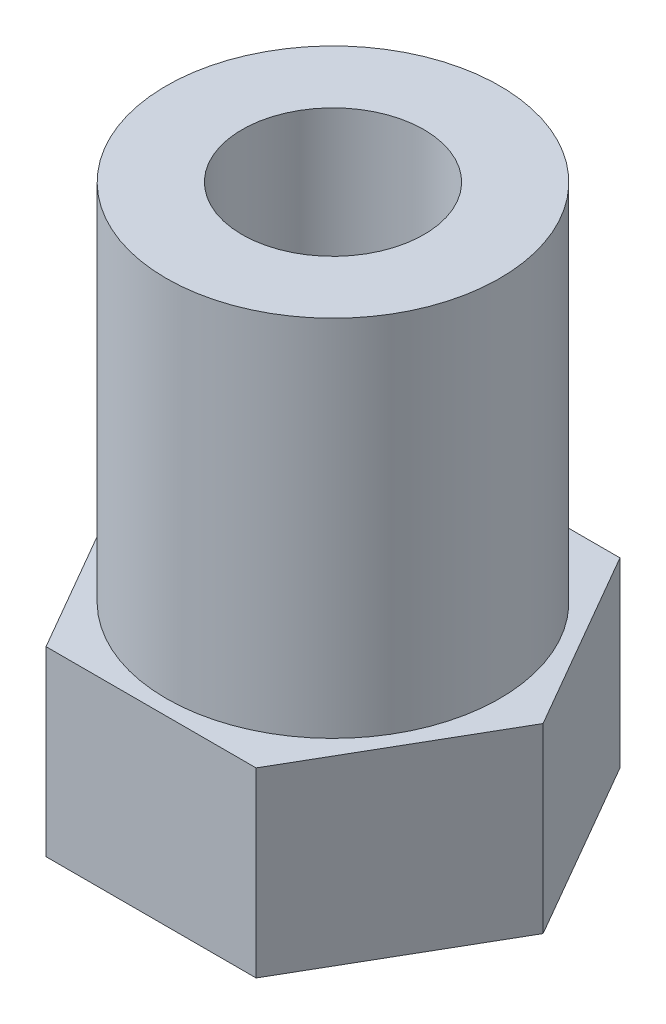
ISO-10303-21;
HEADER;
FILE_DESCRIPTION(('STEP AP214'),'2;1');
FILE_NAME('part.step','',(''),(''),'','','');
FILE_SCHEMA(('AUTOMOTIVE_DESIGN { 1 0 10303 214 1 1 1 1 }'));
ENDSEC;
DATA;
#1=APPLICATION_CONTEXT('core data for automotive mechanical design processes');
#2=APPLICATION_PROTOCOL_DEFINITION('international standard','automotive_design',2000,#1);
#3=PRODUCT_CONTEXT('',#1,'mechanical');
#4=PRODUCT('Part','Part','',(#3));
#5=PRODUCT_RELATED_PRODUCT_CATEGORY('part','',(#4));
#6=PRODUCT_DEFINITION_FORMATION('','',#4);
#7=PRODUCT_DEFINITION_CONTEXT('part definition',#1,'design');
#8=PRODUCT_DEFINITION('design','',#6,#7);
#9=PRODUCT_DEFINITION_SHAPE('','',#8);
#10=(LENGTH_UNIT() NAMED_UNIT(*) SI_UNIT(.MILLI.,.METRE.));
#11=(NAMED_UNIT(*) PLANE_ANGLE_UNIT() SI_UNIT($,.RADIAN.));
#12=(NAMED_UNIT(*) SI_UNIT($,.STERADIAN.) SOLID_ANGLE_UNIT());
#13=UNCERTAINTY_MEASURE_WITH_UNIT(LENGTH_MEASURE(1.E-05),#10,'distance_accuracy_value','');
#14=(GEOMETRIC_REPRESENTATION_CONTEXT(3) GLOBAL_UNCERTAINTY_ASSIGNED_CONTEXT((#13)) GLOBAL_UNIT_ASSIGNED_CONTEXT((#10,
#11,#12)) REPRESENTATION_CONTEXT('',''));
#15=CARTESIAN_POINT('',(0.,0.,0.));
#16=DIRECTION('',(0.,0.,1.));
#17=DIRECTION('',(1.,0.,0.));
#18=AXIS2_PLACEMENT_3D('',#15,#16,#17);
#19=CARTESIAN_POINT('',(0.,6.,0.));
#20=DIRECTION('',(0.,1.,0.));
#21=DIRECTION('',(0.,0.,1.));
#22=AXIS2_PLACEMENT_3D('',#19,#20,#21);
#23=PLANE('',#22);
#24=CARTESIAN_POINT('',(0.,6.,0.));
#25=DIRECTION('',(0.,1.,0.));
#26=DIRECTION('',(0.,0.,1.));
#27=AXIS2_PLACEMENT_3D('',#24,#25,#26);
#28=CIRCLE('',#27,5.5);
#29=CARTESIAN_POINT('',(0.,6.,5.5));
#30=VERTEX_POINT('',#29);
#31=EDGE_CURVE('E11',#30,#30,#28,.T.);
#32=ORIENTED_EDGE('',*,*,#31,.F.);
#33=EDGE_LOOP('',(#32));
#34=FACE_BOUND('',#33,.T.);
#35=DIRECTION('',(0.499999999999999,0.,-0.866025403784439));
#36=VECTOR('',#35,1.);
#37=CARTESIAN_POINT('',(3.46410161513776,6.,6.));
#38=LINE('',#37,#36);
#39=CARTESIAN_POINT('',(3.46410161513776,6.,6.));
#40=VERTEX_POINT('',#39);
#41=CARTESIAN_POINT('',(6.92820323027551,6.,0.));
#42=VERTEX_POINT('',#41);
#43=EDGE_CURVE('E147',#40,#42,#38,.T.);
#44=ORIENTED_EDGE('',*,*,#43,.T.);
#45=DIRECTION('',(-0.5,0.,-0.866025403784439));
#46=VECTOR('',#45,1.);
#47=CARTESIAN_POINT('',(6.92820323027551,6.,0.));
#48=LINE('',#47,#46);
#49=CARTESIAN_POINT('',(3.46410161513775,6.,-6.));
#50=VERTEX_POINT('',#49);
#51=EDGE_CURVE('E96',#42,#50,#48,.T.);
#52=ORIENTED_EDGE('',*,*,#51,.T.);
#53=DIRECTION('',(-1.,0.,0.));
#54=VECTOR('',#53,1.);
#55=CARTESIAN_POINT('',(3.46410161513775,6.,-6.));
#56=LINE('',#55,#54);
#57=CARTESIAN_POINT('',(-3.46410161513776,6.,-6.));
#58=VERTEX_POINT('',#57);
#59=EDGE_CURVE('E108',#50,#58,#56,.T.);
#60=ORIENTED_EDGE('',*,*,#59,.T.);
#61=DIRECTION('',(-0.499999999999999,0.,0.866025403784439));
#62=VECTOR('',#61,1.);
#63=CARTESIAN_POINT('',(-3.46410161513776,6.,-6.));
#64=LINE('',#63,#62);
#65=CARTESIAN_POINT('',(-6.92820323027551,6.,0.));
#66=VERTEX_POINT('',#65);
#67=EDGE_CURVE('E103',#58,#66,#64,.T.);
#68=ORIENTED_EDGE('',*,*,#67,.T.);
#69=DIRECTION('',(0.5,0.,0.866025403784439));
#70=VECTOR('',#69,1.);
#71=CARTESIAN_POINT('',(-6.92820323027551,6.,0.));
#72=LINE('',#71,#70);
#73=CARTESIAN_POINT('',(-3.46410161513775,6.,6.));
#74=VERTEX_POINT('',#73);
#75=EDGE_CURVE('E106',#66,#74,#72,.T.);
#76=ORIENTED_EDGE('',*,*,#75,.T.);
#77=DIRECTION('',(1.,0.,0.));
#78=VECTOR('',#77,1.);
#79=CARTESIAN_POINT('',(-3.46410161513775,6.,6.));
#80=LINE('',#79,#78);
#81=EDGE_CURVE('E58',#74,#40,#80,.T.);
#82=ORIENTED_EDGE('',*,*,#81,.T.);
#83=EDGE_LOOP('',(#44,#52,#60,#68,#76,#82));
#84=FACE_BOUND('',#83,.T.);
#85=ADVANCED_FACE('F39',(#34,#84),#23,.T.);
#86=CARTESIAN_POINT('',(0.,0.,0.));
#87=DIRECTION('',(0.,1.,0.));
#88=DIRECTION('',(0.,0.,1.));
#89=AXIS2_PLACEMENT_3D('',#86,#87,#88);
#90=PLANE('',#89);
#91=DIRECTION('',(0.499999999999999,0.,-0.866025403784439));
#92=VECTOR('',#91,1.);
#93=CARTESIAN_POINT('',(3.46410161513776,0.,6.));
#94=LINE('',#93,#92);
#95=CARTESIAN_POINT('',(3.46410161513776,0.,6.));
#96=VERTEX_POINT('',#95);
#97=CARTESIAN_POINT('',(6.92820323027551,0.,0.));
#98=VERTEX_POINT('',#97);
#99=EDGE_CURVE('E130',#96,#98,#94,.T.);
#100=ORIENTED_EDGE('',*,*,#99,.F.);
#101=DIRECTION('',(1.,0.,0.));
#102=VECTOR('',#101,1.);
#103=CARTESIAN_POINT('',(-3.46410161513775,0.,6.));
#104=LINE('',#103,#102);
#105=CARTESIAN_POINT('',(-3.46410161513775,0.,6.));
#106=VERTEX_POINT('',#105);
#107=EDGE_CURVE('E87',#106,#96,#104,.T.);
#108=ORIENTED_EDGE('',*,*,#107,.F.);
#109=DIRECTION('',(0.5,0.,0.866025403784439));
#110=VECTOR('',#109,1.);
#111=CARTESIAN_POINT('',(-6.92820323027551,0.,0.));
#112=LINE('',#111,#110);
#113=CARTESIAN_POINT('',(-6.92820323027551,0.,0.));
#114=VERTEX_POINT('',#113);
#115=EDGE_CURVE('E81',#114,#106,#112,.T.);
#116=ORIENTED_EDGE('',*,*,#115,.F.);
#117=DIRECTION('',(-0.499999999999999,0.,0.866025403784439));
#118=VECTOR('',#117,1.);
#119=CARTESIAN_POINT('',(-3.46410161513776,0.,-6.));
#120=LINE('',#119,#118);
#121=CARTESIAN_POINT('',(-3.46410161513776,0.,-6.));
#122=VERTEX_POINT('',#121);
#123=EDGE_CURVE('E117',#122,#114,#120,.T.);
#124=ORIENTED_EDGE('',*,*,#123,.F.);
#125=DIRECTION('',(-1.,0.,0.));
#126=VECTOR('',#125,1.);
#127=CARTESIAN_POINT('',(3.46410161513775,0.,-6.));
#128=LINE('',#127,#126);
#129=CARTESIAN_POINT('',(3.46410161513775,0.,-6.));
#130=VERTEX_POINT('',#129);
#131=EDGE_CURVE('E138',#130,#122,#128,.T.);
#132=ORIENTED_EDGE('',*,*,#131,.F.);
#133=DIRECTION('',(-0.5,0.,-0.866025403784439));
#134=VECTOR('',#133,1.);
#135=CARTESIAN_POINT('',(6.92820323027551,0.,0.));
#136=LINE('',#135,#134);
#137=EDGE_CURVE('E134',#98,#130,#136,.T.);
#138=ORIENTED_EDGE('',*,*,#137,.F.);
#139=EDGE_LOOP('',(#100,#108,#116,#124,#132,#138));
#140=FACE_BOUND('',#139,.T.);
#141=CARTESIAN_POINT('',(0.,0.,0.));
#142=DIRECTION('',(0.,1.,0.));
#143=DIRECTION('',(0.,0.,1.));
#144=AXIS2_PLACEMENT_3D('',#141,#142,#143);
#145=CIRCLE('',#144,3.);
#146=CARTESIAN_POINT('',(0.,0.,3.));
#147=VERTEX_POINT('',#146);
#148=EDGE_CURVE('E135',#147,#147,#145,.T.);
#149=ORIENTED_EDGE('',*,*,#148,.T.);
#150=EDGE_LOOP('',(#149));
#151=FACE_BOUND('',#150,.T.);
#152=ADVANCED_FACE('F165',(#140,#151),#90,.F.);
#153=CARTESIAN_POINT('',(3.46410161513776,6.,6.));
#154=DIRECTION('',(-0.866025403784439,0.,-0.5));
#155=DIRECTION('',(-0.5,0.,0.866025403784439));
#156=AXIS2_PLACEMENT_3D('',#153,#154,#155);
#157=PLANE('',#156);
#158=ORIENTED_EDGE('',*,*,#99,.T.);
#159=DIRECTION('',(0.,-1.,0.));
#160=VECTOR('',#159,1.);
#161=CARTESIAN_POINT('',(6.92820323027551,6.,0.));
#162=LINE('',#161,#160);
#163=EDGE_CURVE('E43',#42,#98,#162,.T.);
#164=ORIENTED_EDGE('',*,*,#163,.F.);
#165=ORIENTED_EDGE('',*,*,#43,.F.);
#166=DIRECTION('',(0.,-1.,0.));
#167=VECTOR('',#166,1.);
#168=CARTESIAN_POINT('',(3.46410161513776,6.,6.));
#169=LINE('',#168,#167);
#170=EDGE_CURVE('E126',#40,#96,#169,.T.);
#171=ORIENTED_EDGE('',*,*,#170,.T.);
#172=EDGE_LOOP('',(#158,#164,#165,#171));
#173=FACE_BOUND('',#172,.T.);
#174=ADVANCED_FACE('F41',(#173),#157,.F.);
#175=CARTESIAN_POINT('',(6.92820323027551,6.,0.));
#176=DIRECTION('',(-0.866025403784438,0.,0.5));
#177=DIRECTION('',(0.5,0.,0.866025403784439));
#178=AXIS2_PLACEMENT_3D('',#175,#176,#177);
#179=PLANE('',#178);
#180=ORIENTED_EDGE('',*,*,#137,.T.);
#181=DIRECTION('',(0.,-1.,0.));
#182=VECTOR('',#181,1.);
#183=CARTESIAN_POINT('',(3.46410161513775,6.,-6.));
#184=LINE('',#183,#182);
#185=EDGE_CURVE('E153',#50,#130,#184,.T.);
#186=ORIENTED_EDGE('',*,*,#185,.F.);
#187=ORIENTED_EDGE('',*,*,#51,.F.);
#188=ORIENTED_EDGE('',*,*,#163,.T.);
#189=EDGE_LOOP('',(#180,#186,#187,#188));
#190=FACE_BOUND('',#189,.T.);
#191=ADVANCED_FACE('F160',(#190),#179,.F.);
#192=CARTESIAN_POINT('',(3.46410161513775,6.,-6.));
#193=DIRECTION('',(0.,0.,1.));
#194=DIRECTION('',(1.,0.,0.));
#195=AXIS2_PLACEMENT_3D('',#192,#193,#194);
#196=PLANE('',#195);
#197=ORIENTED_EDGE('',*,*,#131,.T.);
#198=DIRECTION('',(0.,-1.,0.));
#199=VECTOR('',#198,1.);
#200=CARTESIAN_POINT('',(-3.46410161513776,6.,-6.));
#201=LINE('',#200,#199);
#202=EDGE_CURVE('E119',#58,#122,#201,.T.);
#203=ORIENTED_EDGE('',*,*,#202,.F.);
#204=ORIENTED_EDGE('',*,*,#59,.F.);
#205=ORIENTED_EDGE('',*,*,#185,.T.);
#206=EDGE_LOOP('',(#197,#203,#204,#205));
#207=FACE_BOUND('',#206,.T.);
#208=ADVANCED_FACE('F167',(#207),#196,.F.);
#209=CARTESIAN_POINT('',(-3.46410161513776,6.,-6.));
#210=DIRECTION('',(0.866025403784439,0.,0.5));
#211=DIRECTION('',(0.5,0.,-0.866025403784439));
#212=AXIS2_PLACEMENT_3D('',#209,#210,#211);
#213=PLANE('',#212);
#214=ORIENTED_EDGE('',*,*,#123,.T.);
#215=DIRECTION('',(0.,-1.,0.));
#216=VECTOR('',#215,1.);
#217=CARTESIAN_POINT('',(-6.92820323027551,6.,0.));
#218=LINE('',#217,#216);
#219=EDGE_CURVE('E114',#66,#114,#218,.T.);
#220=ORIENTED_EDGE('',*,*,#219,.F.);
#221=ORIENTED_EDGE('',*,*,#67,.F.);
#222=ORIENTED_EDGE('',*,*,#202,.T.);
#223=EDGE_LOOP('',(#214,#220,#221,#222));
#224=FACE_BOUND('',#223,.T.);
#225=ADVANCED_FACE('F115',(#224),#213,.F.);
#226=CARTESIAN_POINT('',(-6.92820323027551,6.,0.));
#227=DIRECTION('',(0.866025403784438,0.,-0.5));
#228=DIRECTION('',(-0.5,0.,-0.866025403784439));
#229=AXIS2_PLACEMENT_3D('',#226,#227,#228);
#230=PLANE('',#229);
#231=ORIENTED_EDGE('',*,*,#115,.T.);
#232=DIRECTION('',(0.,-1.,0.));
#233=VECTOR('',#232,1.);
#234=CARTESIAN_POINT('',(-3.46410161513775,6.,6.));
#235=LINE('',#234,#233);
#236=EDGE_CURVE('E120',#74,#106,#235,.T.);
#237=ORIENTED_EDGE('',*,*,#236,.F.);
#238=ORIENTED_EDGE('',*,*,#75,.F.);
#239=ORIENTED_EDGE('',*,*,#219,.T.);
#240=EDGE_LOOP('',(#231,#237,#238,#239));
#241=FACE_BOUND('',#240,.T.);
#242=ADVANCED_FACE('F122',(#241),#230,.F.);
#243=CARTESIAN_POINT('',(-3.46410161513775,6.,6.));
#244=DIRECTION('',(0.,0.,-1.));
#245=DIRECTION('',(-1.,0.,0.));
#246=AXIS2_PLACEMENT_3D('',#243,#244,#245);
#247=PLANE('',#246);
#248=ORIENTED_EDGE('',*,*,#107,.T.);
#249=ORIENTED_EDGE('',*,*,#170,.F.);
#250=ORIENTED_EDGE('',*,*,#81,.F.);
#251=ORIENTED_EDGE('',*,*,#236,.T.);
#252=EDGE_LOOP('',(#248,#249,#250,#251));
#253=FACE_BOUND('',#252,.T.);
#254=ADVANCED_FACE('F199',(#253),#247,.F.);
#255=CARTESIAN_POINT('',(0.,6.,0.));
#256=DIRECTION('',(0.,-1.,0.));
#257=DIRECTION('',(0.,0.,-1.));
#258=AXIS2_PLACEMENT_3D('',#255,#256,#257);
#259=CYLINDRICAL_SURFACE('',#258,3.);
#260=ORIENTED_EDGE('',*,*,#148,.F.);
#261=EDGE_LOOP('',(#260));
#262=FACE_BOUND('',#261,.T.);
#263=CARTESIAN_POINT('',(0.,18.,0.));
#264=DIRECTION('',(0.,1.,0.));
#265=DIRECTION('',(0.,0.,1.));
#266=AXIS2_PLACEMENT_3D('',#263,#264,#265);
#267=CIRCLE('',#266,3.);
#268=CARTESIAN_POINT('',(0.,18.,3.));
#269=VERTEX_POINT('',#268);
#270=EDGE_CURVE('E181',#269,#269,#267,.T.);
#271=ORIENTED_EDGE('',*,*,#270,.T.);
#272=EDGE_LOOP('',(#271));
#273=FACE_BOUND('',#272,.T.);
#274=ADVANCED_FACE('F186',(#262,#273),#259,.F.);
#275=CARTESIAN_POINT('',(0.,18.,0.));
#276=DIRECTION('',(0.,1.,0.));
#277=DIRECTION('',(0.,0.,1.));
#278=AXIS2_PLACEMENT_3D('',#275,#276,#277);
#279=PLANE('',#278);
#280=CARTESIAN_POINT('',(0.,18.,0.));
#281=DIRECTION('',(0.,1.,0.));
#282=DIRECTION('',(0.,0.,1.));
#283=AXIS2_PLACEMENT_3D('',#280,#281,#282);
#284=CIRCLE('',#283,5.5);
#285=CARTESIAN_POINT('',(0.,18.,5.5));
#286=VERTEX_POINT('',#285);
#287=EDGE_CURVE('E176',#286,#286,#284,.T.);
#288=ORIENTED_EDGE('',*,*,#287,.T.);
#289=EDGE_LOOP('',(#288));
#290=FACE_BOUND('',#289,.T.);
#291=ORIENTED_EDGE('',*,*,#270,.F.);
#292=EDGE_LOOP('',(#291));
#293=FACE_BOUND('',#292,.T.);
#294=ADVANCED_FACE('F188',(#290,#293),#279,.T.);
#295=CARTESIAN_POINT('',(0.,18.,0.));
#296=DIRECTION('',(0.,-1.,0.));
#297=DIRECTION('',(0.,0.,-1.));
#298=AXIS2_PLACEMENT_3D('',#295,#296,#297);
#299=CYLINDRICAL_SURFACE('',#298,5.5);
#300=ORIENTED_EDGE('',*,*,#287,.F.);
#301=EDGE_LOOP('',(#300));
#302=FACE_BOUND('',#301,.T.);
#303=ORIENTED_EDGE('',*,*,#31,.T.);
#304=EDGE_LOOP('',(#303));
#305=FACE_BOUND('',#304,.T.);
#306=ADVANCED_FACE('F190',(#302,#305),#299,.T.);
#307=CLOSED_SHELL('',(#85,#152,#174,#191,#208,#225,#242,#254,#274,#294,#306));
#308=MANIFOLD_SOLID_BREP('B2',#307);
#309=ADVANCED_BREP_SHAPE_REPRESENTATION('',(#18,#308),#14);
#310=SHAPE_DEFINITION_REPRESENTATION(#9,#309);
ENDSEC;
END-ISO-10303-21;
